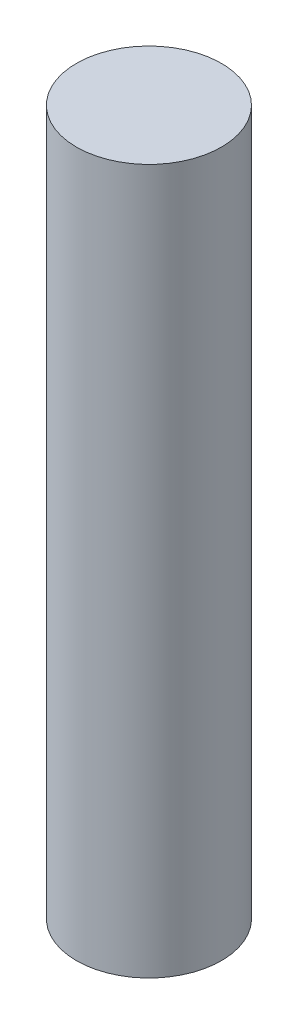
ISO-10303-21;
HEADER;
FILE_DESCRIPTION(('STEP AP214'),'2;1');
FILE_NAME('part.step','',(''),(''),'','','');
FILE_SCHEMA(('AUTOMOTIVE_DESIGN { 1 0 10303 214 1 1 1 1 }'));
ENDSEC;
DATA;
#1=APPLICATION_CONTEXT('core data for automotive mechanical design processes');
#2=APPLICATION_PROTOCOL_DEFINITION('international standard','automotive_design',2000,#1);
#3=PRODUCT_CONTEXT('',#1,'mechanical');
#4=PRODUCT('Part','Part','',(#3));
#5=PRODUCT_RELATED_PRODUCT_CATEGORY('part','',(#4));
#6=PRODUCT_DEFINITION_FORMATION('','',#4);
#7=PRODUCT_DEFINITION_CONTEXT('part definition',#1,'design');
#8=PRODUCT_DEFINITION('design','',#6,#7);
#9=PRODUCT_DEFINITION_SHAPE('','',#8);
#10=(LENGTH_UNIT() NAMED_UNIT(*) SI_UNIT(.MILLI.,.METRE.));
#11=(NAMED_UNIT(*) PLANE_ANGLE_UNIT() SI_UNIT($,.RADIAN.));
#12=(NAMED_UNIT(*) SI_UNIT($,.STERADIAN.) SOLID_ANGLE_UNIT());
#13=UNCERTAINTY_MEASURE_WITH_UNIT(LENGTH_MEASURE(1.E-05),#10,'distance_accuracy_value','');
#14=(GEOMETRIC_REPRESENTATION_CONTEXT(3) GLOBAL_UNCERTAINTY_ASSIGNED_CONTEXT((#13)) GLOBAL_UNIT_ASSIGNED_CONTEXT((#10,
#11,#12)) REPRESENTATION_CONTEXT('',''));
#15=CARTESIAN_POINT('',(0.,0.,0.));
#16=DIRECTION('',(0.,0.,1.));
#17=DIRECTION('',(1.,0.,0.));
#18=AXIS2_PLACEMENT_3D('',#15,#16,#17);
#19=CARTESIAN_POINT('',(0.,-17.,6.));
#20=DIRECTION('',(0.,1.,0.));
#21=DIRECTION('',(0.,0.,1.));
#22=AXIS2_PLACEMENT_3D('',#19,#20,#21);
#23=CYLINDRICAL_SURFACE('',#22,7.00000000000001);
#24=CARTESIAN_POINT('',(0.,51.,6.));
#25=DIRECTION('',(0.,1.,0.));
#26=DIRECTION('',(0.,0.,1.));
#27=AXIS2_PLACEMENT_3D('',#24,#25,#26);
#28=CIRCLE('',#27,7.00000000000001);
#29=CARTESIAN_POINT('',(0.,51.,13.));
#30=VERTEX_POINT('',#29);
#31=EDGE_CURVE('E10',#30,#30,#28,.T.);
#32=ORIENTED_EDGE('',*,*,#31,.F.);
#33=EDGE_LOOP('',(#32));
#34=FACE_BOUND('',#33,.T.);
#35=CARTESIAN_POINT('',(0.,-17.,6.));
#36=DIRECTION('',(0.,1.,0.));
#37=DIRECTION('',(0.,0.,1.));
#38=AXIS2_PLACEMENT_3D('',#35,#36,#37);
#39=CIRCLE('',#38,7.00000000000001);
#40=CARTESIAN_POINT('',(0.,-17.,13.));
#41=VERTEX_POINT('',#40);
#42=EDGE_CURVE('E48',#41,#41,#39,.T.);
#43=ORIENTED_EDGE('',*,*,#42,.T.);
#44=EDGE_LOOP('',(#43));
#45=FACE_BOUND('',#44,.T.);
#46=ADVANCED_FACE('F41',(#34,#45),#23,.T.);
#47=CARTESIAN_POINT('',(0.,51.,-1.00000000000001));
#48=DIRECTION('',(0.,-1.,0.));
#49=DIRECTION('',(0.,0.,-1.));
#50=AXIS2_PLACEMENT_3D('',#47,#48,#49);
#51=PLANE('',#50);
#52=ORIENTED_EDGE('',*,*,#31,.T.);
#53=EDGE_LOOP('',(#52));
#54=FACE_BOUND('',#53,.T.);
#55=ADVANCED_FACE('F58',(#54),#51,.F.);
#56=CARTESIAN_POINT('',(0.,-17.,-1.00000000000001));
#57=DIRECTION('',(0.,1.,0.));
#58=DIRECTION('',(0.,0.,1.));
#59=AXIS2_PLACEMENT_3D('',#56,#57,#58);
#60=PLANE('',#59);
#61=ORIENTED_EDGE('',*,*,#42,.F.);
#62=EDGE_LOOP('',(#61));
#63=FACE_BOUND('',#62,.T.);
#64=ADVANCED_FACE('F56',(#63),#60,.F.);
#65=CLOSED_SHELL('',(#46,#55,#64));
#66=MANIFOLD_SOLID_BREP('B2',#65);
#67=ADVANCED_BREP_SHAPE_REPRESENTATION('',(#18,#66),#14);
#68=SHAPE_DEFINITION_REPRESENTATION(#9,#67);
ENDSEC;
END-ISO-10303-21;
